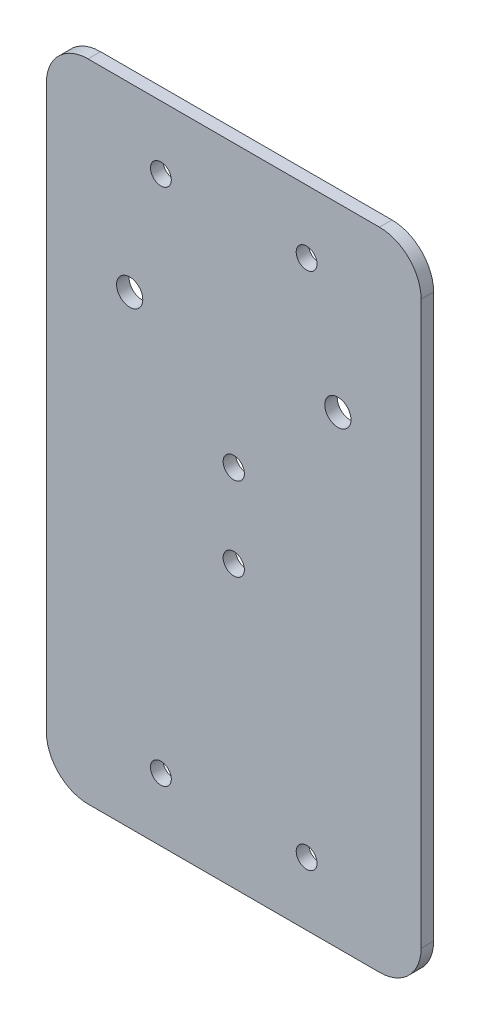
ISO-10303-21;
HEADER;
FILE_DESCRIPTION(('STEP AP214'),'2;1');
FILE_NAME('part.step','',(''),(''),'','','');
FILE_SCHEMA(('AUTOMOTIVE_DESIGN { 1 0 10303 214 1 1 1 1 }'));
ENDSEC;
DATA;
#1=APPLICATION_CONTEXT('core data for automotive mechanical design processes');
#2=APPLICATION_PROTOCOL_DEFINITION('international standard','automotive_design',2000,#1);
#3=PRODUCT_CONTEXT('',#1,'mechanical');
#4=PRODUCT('Part','Part','',(#3));
#5=PRODUCT_RELATED_PRODUCT_CATEGORY('part','',(#4));
#6=PRODUCT_DEFINITION_FORMATION('','',#4);
#7=PRODUCT_DEFINITION_CONTEXT('part definition',#1,'design');
#8=PRODUCT_DEFINITION('design','',#6,#7);
#9=PRODUCT_DEFINITION_SHAPE('','',#8);
#10=(LENGTH_UNIT() NAMED_UNIT(*) SI_UNIT(.MILLI.,.METRE.));
#11=(NAMED_UNIT(*) PLANE_ANGLE_UNIT() SI_UNIT($,.RADIAN.));
#12=(NAMED_UNIT(*) SI_UNIT($,.STERADIAN.) SOLID_ANGLE_UNIT());
#13=UNCERTAINTY_MEASURE_WITH_UNIT(LENGTH_MEASURE(1.E-05),#10,'distance_accuracy_value','');
#14=(GEOMETRIC_REPRESENTATION_CONTEXT(3) GLOBAL_UNCERTAINTY_ASSIGNED_CONTEXT((#13)) GLOBAL_UNIT_ASSIGNED_CONTEXT((#10,
#11,#12)) REPRESENTATION_CONTEXT('',''));
#15=CARTESIAN_POINT('',(0.,0.,0.));
#16=DIRECTION('',(0.,0.,1.));
#17=DIRECTION('',(1.,0.,0.));
#18=AXIS2_PLACEMENT_3D('',#15,#16,#17);
#19=CARTESIAN_POINT('',(35.,-67.5,3.));
#20=DIRECTION('',(0.,0.,-1.));
#21=DIRECTION('',(-1.,0.,0.));
#22=AXIS2_PLACEMENT_3D('',#19,#20,#21);
#23=PLANE('',#22);
#24=CARTESIAN_POINT('',(35.,-67.5,3.));
#25=DIRECTION('',(0.,0.,1.));
#26=DIRECTION('',(-1.,0.,0.));
#27=AXIS2_PLACEMENT_3D('',#24,#25,#26);
#28=CIRCLE('',#27,9.99999999999999);
#29=CARTESIAN_POINT('',(35.,-77.5,3.));
#30=VERTEX_POINT('',#29);
#31=CARTESIAN_POINT('',(45.,-67.5,3.));
#32=VERTEX_POINT('',#31);
#33=EDGE_CURVE('E151',#30,#32,#28,.T.);
#34=ORIENTED_EDGE('',*,*,#33,.T.);
#35=DIRECTION('',(0.,1.,0.));
#36=VECTOR('',#35,1.);
#37=CARTESIAN_POINT('',(45.,67.5,3.));
#38=LINE('',#37,#36);
#39=CARTESIAN_POINT('',(45.,67.5,3.));
#40=VERTEX_POINT('',#39);
#41=EDGE_CURVE('E99',#32,#40,#38,.T.);
#42=ORIENTED_EDGE('',*,*,#41,.T.);
#43=CARTESIAN_POINT('',(35.,67.5,3.));
#44=DIRECTION('',(0.,0.,1.));
#45=DIRECTION('',(-1.,0.,0.));
#46=AXIS2_PLACEMENT_3D('',#43,#44,#45);
#47=CIRCLE('',#46,10.);
#48=CARTESIAN_POINT('',(35.,77.5,3.));
#49=VERTEX_POINT('',#48);
#50=EDGE_CURVE('E166',#40,#49,#47,.T.);
#51=ORIENTED_EDGE('',*,*,#50,.T.);
#52=DIRECTION('',(-1.,0.,0.));
#53=VECTOR('',#52,1.);
#54=CARTESIAN_POINT('',(35.,77.5,3.));
#55=LINE('',#54,#53);
#56=CARTESIAN_POINT('',(-35.,77.5,3.));
#57=VERTEX_POINT('',#56);
#58=EDGE_CURVE('E179',#49,#57,#55,.T.);
#59=ORIENTED_EDGE('',*,*,#58,.T.);
#60=CARTESIAN_POINT('',(-35.,67.5,3.));
#61=DIRECTION('',(0.,0.,1.));
#62=DIRECTION('',(1.,0.,0.));
#63=AXIS2_PLACEMENT_3D('',#60,#61,#62);
#64=CIRCLE('',#63,10.);
#65=CARTESIAN_POINT('',(-45.,67.5,3.));
#66=VERTEX_POINT('',#65);
#67=EDGE_CURVE('E118',#57,#66,#64,.T.);
#68=ORIENTED_EDGE('',*,*,#67,.T.);
#69=DIRECTION('',(0.,-1.,0.));
#70=VECTOR('',#69,1.);
#71=CARTESIAN_POINT('',(-45.,67.5,3.));
#72=LINE('',#71,#70);
#73=CARTESIAN_POINT('',(-45.,-67.5,3.));
#74=VERTEX_POINT('',#73);
#75=EDGE_CURVE('E112',#66,#74,#72,.T.);
#76=ORIENTED_EDGE('',*,*,#75,.T.);
#77=CARTESIAN_POINT('',(-35.,-67.5,3.));
#78=DIRECTION('',(0.,0.,1.));
#79=DIRECTION('',(-1.,0.,0.));
#80=AXIS2_PLACEMENT_3D('',#77,#78,#79);
#81=CIRCLE('',#80,10.);
#82=CARTESIAN_POINT('',(-35.,-77.5,3.));
#83=VERTEX_POINT('',#82);
#84=EDGE_CURVE('E116',#74,#83,#81,.T.);
#85=ORIENTED_EDGE('',*,*,#84,.T.);
#86=DIRECTION('',(1.,0.,0.));
#87=VECTOR('',#86,1.);
#88=CARTESIAN_POINT('',(35.,-77.5,3.));
#89=LINE('',#88,#87);
#90=EDGE_CURVE('E56',#83,#30,#89,.T.);
#91=ORIENTED_EDGE('',*,*,#90,.T.);
#92=EDGE_LOOP('',(#34,#42,#51,#59,#68,#76,#85,#91));
#93=FACE_BOUND('',#92,.T.);
#94=CARTESIAN_POINT('',(17.5,62.325,3.));
#95=DIRECTION('',(0.,0.,1.));
#96=DIRECTION('',(1.,0.,0.));
#97=AXIS2_PLACEMENT_3D('',#94,#95,#96);
#98=CIRCLE('',#97,2.5);
#99=CARTESIAN_POINT('',(20.,62.325,3.));
#100=VERTEX_POINT('',#99);
#101=EDGE_CURVE('E140',#100,#100,#98,.T.);
#102=ORIENTED_EDGE('',*,*,#101,.F.);
#103=EDGE_LOOP('',(#102));
#104=FACE_BOUND('',#103,.T.);
#105=CARTESIAN_POINT('',(17.5,-62.325,3.));
#106=DIRECTION('',(0.,0.,1.));
#107=DIRECTION('',(-1.,0.,0.));
#108=AXIS2_PLACEMENT_3D('',#105,#106,#107);
#109=CIRCLE('',#108,2.5);
#110=CARTESIAN_POINT('',(15.,-62.325,3.));
#111=VERTEX_POINT('',#110);
#112=EDGE_CURVE('E188',#111,#111,#109,.T.);
#113=ORIENTED_EDGE('',*,*,#112,.F.);
#114=EDGE_LOOP('',(#113));
#115=FACE_BOUND('',#114,.T.);
#116=CARTESIAN_POINT('',(-17.4999999999996,-62.3250000000002,3.));
#117=DIRECTION('',(0.,0.,1.));
#118=DIRECTION('',(1.,0.,0.));
#119=AXIS2_PLACEMENT_3D('',#116,#117,#118);
#120=CIRCLE('',#119,2.5);
#121=CARTESIAN_POINT('',(-14.9999999999996,-62.3250000000002,3.));
#122=VERTEX_POINT('',#121);
#123=EDGE_CURVE('E194',#122,#122,#120,.T.);
#124=ORIENTED_EDGE('',*,*,#123,.F.);
#125=EDGE_LOOP('',(#124));
#126=FACE_BOUND('',#125,.T.);
#127=CARTESIAN_POINT('',(-17.5000000000004,62.325,3.));
#128=DIRECTION('',(0.,0.,1.));
#129=DIRECTION('',(-1.,0.,0.));
#130=AXIS2_PLACEMENT_3D('',#127,#128,#129);
#131=CIRCLE('',#130,2.50000000000001);
#132=CARTESIAN_POINT('',(-20.0000000000004,62.325,3.));
#133=VERTEX_POINT('',#132);
#134=EDGE_CURVE('E200',#133,#133,#131,.T.);
#135=ORIENTED_EDGE('',*,*,#134,.F.);
#136=EDGE_LOOP('',(#135));
#137=FACE_BOUND('',#136,.T.);
#138=CARTESIAN_POINT('',(0.,10.,3.));
#139=DIRECTION('',(0.,0.,1.));
#140=DIRECTION('',(1.,0.,0.));
#141=AXIS2_PLACEMENT_3D('',#138,#139,#140);
#142=CIRCLE('',#141,2.55);
#143=CARTESIAN_POINT('',(2.55,10.,3.));
#144=VERTEX_POINT('',#143);
#145=EDGE_CURVE('E206',#144,#144,#142,.T.);
#146=ORIENTED_EDGE('',*,*,#145,.F.);
#147=EDGE_LOOP('',(#146));
#148=FACE_BOUND('',#147,.T.);
#149=CARTESIAN_POINT('',(0.,-10.,3.));
#150=DIRECTION('',(0.,0.,1.));
#151=DIRECTION('',(-1.,0.,0.));
#152=AXIS2_PLACEMENT_3D('',#149,#150,#151);
#153=CIRCLE('',#152,2.55);
#154=CARTESIAN_POINT('',(-2.55,-10.,3.));
#155=VERTEX_POINT('',#154);
#156=EDGE_CURVE('E212',#155,#155,#153,.T.);
#157=ORIENTED_EDGE('',*,*,#156,.F.);
#158=EDGE_LOOP('',(#157));
#159=FACE_BOUND('',#158,.T.);
#160=CARTESIAN_POINT('',(-25.,34.,3.));
#161=DIRECTION('',(0.,0.,1.));
#162=DIRECTION('',(1.,0.,0.));
#163=AXIS2_PLACEMENT_3D('',#160,#161,#162);
#164=CIRCLE('',#163,3.15);
#165=CARTESIAN_POINT('',(-21.85,34.,3.));
#166=VERTEX_POINT('',#165);
#167=EDGE_CURVE('E218',#166,#166,#164,.T.);
#168=ORIENTED_EDGE('',*,*,#167,.F.);
#169=EDGE_LOOP('',(#168));
#170=FACE_BOUND('',#169,.T.);
#171=CARTESIAN_POINT('',(25.,34.,3.));
#172=DIRECTION('',(0.,0.,1.));
#173=DIRECTION('',(-1.,0.,0.));
#174=AXIS2_PLACEMENT_3D('',#171,#172,#173);
#175=CIRCLE('',#174,3.15);
#176=CARTESIAN_POINT('',(21.85,34.,3.));
#177=VERTEX_POINT('',#176);
#178=EDGE_CURVE('E224',#177,#177,#175,.T.);
#179=ORIENTED_EDGE('',*,*,#178,.F.);
#180=EDGE_LOOP('',(#179));
#181=FACE_BOUND('',#180,.T.);
#182=ADVANCED_FACE('F39',(#93,#104,#115,#126,#137,#148,#159,#170,#181),#23,.F.);
#183=CARTESIAN_POINT('',(35.,-67.5,0.));
#184=DIRECTION('',(0.,0.,-1.));
#185=DIRECTION('',(-1.,0.,0.));
#186=AXIS2_PLACEMENT_3D('',#183,#184,#185);
#187=PLANE('',#186);
#188=CARTESIAN_POINT('',(-25.,34.,0.));
#189=DIRECTION('',(0.,0.,1.));
#190=DIRECTION('',(1.,0.,0.));
#191=AXIS2_PLACEMENT_3D('',#188,#189,#190);
#192=CIRCLE('',#191,3.15);
#193=CARTESIAN_POINT('',(-21.85,34.,0.));
#194=VERTEX_POINT('',#193);
#195=EDGE_CURVE('E221',#194,#194,#192,.T.);
#196=ORIENTED_EDGE('',*,*,#195,.T.);
#197=EDGE_LOOP('',(#196));
#198=FACE_BOUND('',#197,.T.);
#199=CARTESIAN_POINT('',(0.,10.,0.));
#200=DIRECTION('',(0.,0.,1.));
#201=DIRECTION('',(1.,0.,0.));
#202=AXIS2_PLACEMENT_3D('',#199,#200,#201);
#203=CIRCLE('',#202,2.55);
#204=CARTESIAN_POINT('',(2.55,10.,0.));
#205=VERTEX_POINT('',#204);
#206=EDGE_CURVE('E209',#205,#205,#203,.T.);
#207=ORIENTED_EDGE('',*,*,#206,.T.);
#208=EDGE_LOOP('',(#207));
#209=FACE_BOUND('',#208,.T.);
#210=CARTESIAN_POINT('',(-17.4999999999996,-62.3250000000002,0.));
#211=DIRECTION('',(0.,0.,1.));
#212=DIRECTION('',(1.,0.,0.));
#213=AXIS2_PLACEMENT_3D('',#210,#211,#212);
#214=CIRCLE('',#213,2.5);
#215=CARTESIAN_POINT('',(-14.9999999999996,-62.3250000000002,0.));
#216=VERTEX_POINT('',#215);
#217=EDGE_CURVE('E197',#216,#216,#214,.T.);
#218=ORIENTED_EDGE('',*,*,#217,.T.);
#219=EDGE_LOOP('',(#218));
#220=FACE_BOUND('',#219,.T.);
#221=CARTESIAN_POINT('',(17.5,62.325,0.));
#222=DIRECTION('',(0.,0.,1.));
#223=DIRECTION('',(1.,0.,0.));
#224=AXIS2_PLACEMENT_3D('',#221,#222,#223);
#225=CIRCLE('',#224,2.5);
#226=CARTESIAN_POINT('',(20.,62.325,0.));
#227=VERTEX_POINT('',#226);
#228=EDGE_CURVE('E185',#227,#227,#225,.T.);
#229=ORIENTED_EDGE('',*,*,#228,.T.);
#230=EDGE_LOOP('',(#229));
#231=FACE_BOUND('',#230,.T.);
#232=CARTESIAN_POINT('',(35.,-67.5,0.));
#233=DIRECTION('',(0.,0.,1.));
#234=DIRECTION('',(-1.,0.,0.));
#235=AXIS2_PLACEMENT_3D('',#232,#233,#234);
#236=CIRCLE('',#235,9.99999999999999);
#237=CARTESIAN_POINT('',(35.,-77.5,0.));
#238=VERTEX_POINT('',#237);
#239=CARTESIAN_POINT('',(45.,-67.5,0.));
#240=VERTEX_POINT('',#239);
#241=EDGE_CURVE('E136',#238,#240,#236,.T.);
#242=ORIENTED_EDGE('',*,*,#241,.F.);
#243=DIRECTION('',(1.,0.,0.));
#244=VECTOR('',#243,1.);
#245=CARTESIAN_POINT('',(35.,-77.5,0.));
#246=LINE('',#245,#244);
#247=CARTESIAN_POINT('',(-35.,-77.5,0.));
#248=VERTEX_POINT('',#247);
#249=EDGE_CURVE('E91',#248,#238,#246,.T.);
#250=ORIENTED_EDGE('',*,*,#249,.F.);
#251=CARTESIAN_POINT('',(-35.,-67.5,0.));
#252=DIRECTION('',(0.,0.,1.));
#253=DIRECTION('',(-1.,0.,0.));
#254=AXIS2_PLACEMENT_3D('',#251,#252,#253);
#255=CIRCLE('',#254,10.);
#256=CARTESIAN_POINT('',(-45.,-67.5,0.));
#257=VERTEX_POINT('',#256);
#258=EDGE_CURVE('E85',#257,#248,#255,.T.);
#259=ORIENTED_EDGE('',*,*,#258,.F.);
#260=DIRECTION('',(0.,-1.,0.));
#261=VECTOR('',#260,1.);
#262=CARTESIAN_POINT('',(-45.,67.5,0.));
#263=LINE('',#262,#261);
#264=CARTESIAN_POINT('',(-45.,67.5,0.));
#265=VERTEX_POINT('',#264);
#266=EDGE_CURVE('E126',#265,#257,#263,.T.);
#267=ORIENTED_EDGE('',*,*,#266,.F.);
#268=CARTESIAN_POINT('',(-35.,67.5,0.));
#269=DIRECTION('',(0.,0.,1.));
#270=DIRECTION('',(1.,0.,0.));
#271=AXIS2_PLACEMENT_3D('',#268,#269,#270);
#272=CIRCLE('',#271,10.);
#273=CARTESIAN_POINT('',(-35.,77.5,0.));
#274=VERTEX_POINT('',#273);
#275=EDGE_CURVE('E146',#274,#265,#272,.T.);
#276=ORIENTED_EDGE('',*,*,#275,.F.);
#277=DIRECTION('',(-1.,0.,0.));
#278=VECTOR('',#277,1.);
#279=CARTESIAN_POINT('',(35.,77.5,0.));
#280=LINE('',#279,#278);
#281=CARTESIAN_POINT('',(35.,77.5,0.));
#282=VERTEX_POINT('',#281);
#283=EDGE_CURVE('E144',#282,#274,#280,.T.);
#284=ORIENTED_EDGE('',*,*,#283,.F.);
#285=CARTESIAN_POINT('',(35.,67.5,0.));
#286=DIRECTION('',(0.,0.,1.));
#287=DIRECTION('',(-1.,0.,0.));
#288=AXIS2_PLACEMENT_3D('',#285,#286,#287);
#289=CIRCLE('',#288,10.);
#290=CARTESIAN_POINT('',(45.,67.5,0.));
#291=VERTEX_POINT('',#290);
#292=EDGE_CURVE('E142',#291,#282,#289,.T.);
#293=ORIENTED_EDGE('',*,*,#292,.F.);
#294=DIRECTION('',(0.,1.,0.));
#295=VECTOR('',#294,1.);
#296=CARTESIAN_POINT('',(45.,67.5,0.));
#297=LINE('',#296,#295);
#298=EDGE_CURVE('E139',#240,#291,#297,.T.);
#299=ORIENTED_EDGE('',*,*,#298,.F.);
#300=EDGE_LOOP('',(#242,#250,#259,#267,#276,#284,#293,#299));
#301=FACE_BOUND('',#300,.T.);
#302=CARTESIAN_POINT('',(17.5,-62.325,0.));
#303=DIRECTION('',(0.,0.,1.));
#304=DIRECTION('',(-1.,0.,0.));
#305=AXIS2_PLACEMENT_3D('',#302,#303,#304);
#306=CIRCLE('',#305,2.5);
#307=CARTESIAN_POINT('',(15.,-62.325,0.));
#308=VERTEX_POINT('',#307);
#309=EDGE_CURVE('E191',#308,#308,#306,.T.);
#310=ORIENTED_EDGE('',*,*,#309,.T.);
#311=EDGE_LOOP('',(#310));
#312=FACE_BOUND('',#311,.T.);
#313=CARTESIAN_POINT('',(-17.5000000000004,62.325,0.));
#314=DIRECTION('',(0.,0.,1.));
#315=DIRECTION('',(-1.,0.,0.));
#316=AXIS2_PLACEMENT_3D('',#313,#314,#315);
#317=CIRCLE('',#316,2.50000000000001);
#318=CARTESIAN_POINT('',(-20.0000000000004,62.325,0.));
#319=VERTEX_POINT('',#318);
#320=EDGE_CURVE('E203',#319,#319,#317,.T.);
#321=ORIENTED_EDGE('',*,*,#320,.T.);
#322=EDGE_LOOP('',(#321));
#323=FACE_BOUND('',#322,.T.);
#324=CARTESIAN_POINT('',(0.,-10.,0.));
#325=DIRECTION('',(0.,0.,1.));
#326=DIRECTION('',(-1.,0.,0.));
#327=AXIS2_PLACEMENT_3D('',#324,#325,#326);
#328=CIRCLE('',#327,2.55);
#329=CARTESIAN_POINT('',(-2.55,-10.,0.));
#330=VERTEX_POINT('',#329);
#331=EDGE_CURVE('E215',#330,#330,#328,.T.);
#332=ORIENTED_EDGE('',*,*,#331,.T.);
#333=EDGE_LOOP('',(#332));
#334=FACE_BOUND('',#333,.T.);
#335=CARTESIAN_POINT('',(25.,34.,0.));
#336=DIRECTION('',(0.,0.,1.));
#337=DIRECTION('',(-1.,0.,0.));
#338=AXIS2_PLACEMENT_3D('',#335,#336,#337);
#339=CIRCLE('',#338,3.15);
#340=CARTESIAN_POINT('',(21.85,34.,0.));
#341=VERTEX_POINT('',#340);
#342=EDGE_CURVE('E227',#341,#341,#339,.T.);
#343=ORIENTED_EDGE('',*,*,#342,.T.);
#344=EDGE_LOOP('',(#343));
#345=FACE_BOUND('',#344,.T.);
#346=ADVANCED_FACE('F170',(#198,#209,#220,#231,#301,#312,#323,#334,#345),#187,.T.);
#347=CARTESIAN_POINT('',(35.,-67.5,3.));
#348=DIRECTION('',(0.,0.,-1.));
#349=DIRECTION('',(-1.,0.,0.));
#350=AXIS2_PLACEMENT_3D('',#347,#348,#349);
#351=CYLINDRICAL_SURFACE('',#350,9.99999999999999);
#352=ORIENTED_EDGE('',*,*,#241,.T.);
#353=DIRECTION('',(0.,0.,-1.));
#354=VECTOR('',#353,1.);
#355=CARTESIAN_POINT('',(45.,-67.5,3.));
#356=LINE('',#355,#354);
#357=EDGE_CURVE('E11',#32,#240,#356,.T.);
#358=ORIENTED_EDGE('',*,*,#357,.F.);
#359=ORIENTED_EDGE('',*,*,#33,.F.);
#360=DIRECTION('',(0.,0.,-1.));
#361=VECTOR('',#360,1.);
#362=CARTESIAN_POINT('',(35.,-77.5,3.));
#363=LINE('',#362,#361);
#364=EDGE_CURVE('E132',#30,#238,#363,.T.);
#365=ORIENTED_EDGE('',*,*,#364,.T.);
#366=EDGE_LOOP('',(#352,#358,#359,#365));
#367=FACE_BOUND('',#366,.T.);
#368=ADVANCED_FACE('F41',(#367),#351,.T.);
#369=CARTESIAN_POINT('',(45.,67.5,3.));
#370=DIRECTION('',(-1.,0.,0.));
#371=DIRECTION('',(0.,-1.,0.));
#372=AXIS2_PLACEMENT_3D('',#369,#370,#371);
#373=PLANE('',#372);
#374=ORIENTED_EDGE('',*,*,#298,.T.);
#375=DIRECTION('',(0.,0.,-1.));
#376=VECTOR('',#375,1.);
#377=CARTESIAN_POINT('',(45.,67.5,3.));
#378=LINE('',#377,#376);
#379=EDGE_CURVE('E48',#40,#291,#378,.T.);
#380=ORIENTED_EDGE('',*,*,#379,.F.);
#381=ORIENTED_EDGE('',*,*,#41,.F.);
#382=ORIENTED_EDGE('',*,*,#357,.T.);
#383=EDGE_LOOP('',(#374,#380,#381,#382));
#384=FACE_BOUND('',#383,.T.);
#385=ADVANCED_FACE('F259',(#384),#373,.F.);
#386=CARTESIAN_POINT('',(35.,67.5,3.));
#387=DIRECTION('',(0.,0.,-1.));
#388=DIRECTION('',(-1.,0.,0.));
#389=AXIS2_PLACEMENT_3D('',#386,#387,#388);
#390=CYLINDRICAL_SURFACE('',#389,10.);
#391=ORIENTED_EDGE('',*,*,#292,.T.);
#392=DIRECTION('',(0.,0.,-1.));
#393=VECTOR('',#392,1.);
#394=CARTESIAN_POINT('',(35.,77.5,3.));
#395=LINE('',#394,#393);
#396=EDGE_CURVE('E158',#49,#282,#395,.T.);
#397=ORIENTED_EDGE('',*,*,#396,.F.);
#398=ORIENTED_EDGE('',*,*,#50,.F.);
#399=ORIENTED_EDGE('',*,*,#379,.T.);
#400=EDGE_LOOP('',(#391,#397,#398,#399));
#401=FACE_BOUND('',#400,.T.);
#402=ADVANCED_FACE('F164',(#401),#390,.T.);
#403=CARTESIAN_POINT('',(35.,77.5,3.));
#404=DIRECTION('',(0.,-1.,0.));
#405=DIRECTION('',(0.,0.,-1.));
#406=AXIS2_PLACEMENT_3D('',#403,#404,#405);
#407=PLANE('',#406);
#408=ORIENTED_EDGE('',*,*,#283,.T.);
#409=DIRECTION('',(0.,0.,-1.));
#410=VECTOR('',#409,1.);
#411=CARTESIAN_POINT('',(-35.,77.5,3.));
#412=LINE('',#411,#410);
#413=EDGE_CURVE('E155',#57,#274,#412,.T.);
#414=ORIENTED_EDGE('',*,*,#413,.F.);
#415=ORIENTED_EDGE('',*,*,#58,.F.);
#416=ORIENTED_EDGE('',*,*,#396,.T.);
#417=EDGE_LOOP('',(#408,#414,#415,#416));
#418=FACE_BOUND('',#417,.T.);
#419=ADVANCED_FACE('F175',(#418),#407,.F.);
#420=CARTESIAN_POINT('',(-35.,67.5,3.));
#421=DIRECTION('',(0.,0.,-1.));
#422=DIRECTION('',(-1.,0.,0.));
#423=AXIS2_PLACEMENT_3D('',#420,#421,#422);
#424=CYLINDRICAL_SURFACE('',#423,10.);
#425=ORIENTED_EDGE('',*,*,#275,.T.);
#426=DIRECTION('',(0.,0.,-1.));
#427=VECTOR('',#426,1.);
#428=CARTESIAN_POINT('',(-45.,67.5,3.));
#429=LINE('',#428,#427);
#430=EDGE_CURVE('E127',#66,#265,#429,.T.);
#431=ORIENTED_EDGE('',*,*,#430,.F.);
#432=ORIENTED_EDGE('',*,*,#67,.F.);
#433=ORIENTED_EDGE('',*,*,#413,.T.);
#434=EDGE_LOOP('',(#425,#431,#432,#433));
#435=FACE_BOUND('',#434,.T.);
#436=ADVANCED_FACE('F178',(#435),#424,.T.);
#437=CARTESIAN_POINT('',(-45.,67.5,3.));
#438=DIRECTION('',(1.,0.,0.));
#439=DIRECTION('',(0.,1.,0.));
#440=AXIS2_PLACEMENT_3D('',#437,#438,#439);
#441=PLANE('',#440);
#442=ORIENTED_EDGE('',*,*,#266,.T.);
#443=DIRECTION('',(0.,0.,-1.));
#444=VECTOR('',#443,1.);
#445=CARTESIAN_POINT('',(-45.,-67.5,3.));
#446=LINE('',#445,#444);
#447=EDGE_CURVE('E123',#74,#257,#446,.T.);
#448=ORIENTED_EDGE('',*,*,#447,.F.);
#449=ORIENTED_EDGE('',*,*,#75,.F.);
#450=ORIENTED_EDGE('',*,*,#430,.T.);
#451=EDGE_LOOP('',(#442,#448,#449,#450));
#452=FACE_BOUND('',#451,.T.);
#453=ADVANCED_FACE('F124',(#452),#441,.F.);
#454=CARTESIAN_POINT('',(-35.,-67.5,3.));
#455=DIRECTION('',(0.,0.,-1.));
#456=DIRECTION('',(-1.,0.,0.));
#457=AXIS2_PLACEMENT_3D('',#454,#455,#456);
#458=CYLINDRICAL_SURFACE('',#457,10.);
#459=ORIENTED_EDGE('',*,*,#258,.T.);
#460=DIRECTION('',(0.,0.,-1.));
#461=VECTOR('',#460,1.);
#462=CARTESIAN_POINT('',(-35.,-77.5,3.));
#463=LINE('',#462,#461);
#464=EDGE_CURVE('E128',#83,#248,#463,.T.);
#465=ORIENTED_EDGE('',*,*,#464,.F.);
#466=ORIENTED_EDGE('',*,*,#84,.F.);
#467=ORIENTED_EDGE('',*,*,#447,.T.);
#468=EDGE_LOOP('',(#459,#465,#466,#467));
#469=FACE_BOUND('',#468,.T.);
#470=ADVANCED_FACE('F130',(#469),#458,.T.);
#471=CARTESIAN_POINT('',(35.,-77.5,3.));
#472=DIRECTION('',(0.,1.,0.));
#473=DIRECTION('',(-1.,0.,0.));
#474=AXIS2_PLACEMENT_3D('',#471,#472,#473);
#475=PLANE('',#474);
#476=ORIENTED_EDGE('',*,*,#249,.T.);
#477=ORIENTED_EDGE('',*,*,#364,.F.);
#478=ORIENTED_EDGE('',*,*,#90,.F.);
#479=ORIENTED_EDGE('',*,*,#464,.T.);
#480=EDGE_LOOP('',(#476,#477,#478,#479));
#481=FACE_BOUND('',#480,.T.);
#482=ADVANCED_FACE('F247',(#481),#475,.F.);
#483=CARTESIAN_POINT('',(17.5,62.325,3.));
#484=DIRECTION('',(0.,0.,-1.));
#485=DIRECTION('',(-1.,0.,0.));
#486=AXIS2_PLACEMENT_3D('',#483,#484,#485);
#487=CYLINDRICAL_SURFACE('',#486,2.5);
#488=ORIENTED_EDGE('',*,*,#101,.T.);
#489=EDGE_LOOP('',(#488));
#490=FACE_BOUND('',#489,.T.);
#491=ORIENTED_EDGE('',*,*,#228,.F.);
#492=EDGE_LOOP('',(#491));
#493=FACE_BOUND('',#492,.T.);
#494=ADVANCED_FACE('F244',(#490,#493),#487,.F.);
#495=CARTESIAN_POINT('',(17.5,-62.325,3.));
#496=DIRECTION('',(0.,0.,-1.));
#497=DIRECTION('',(-1.,0.,0.));
#498=AXIS2_PLACEMENT_3D('',#495,#496,#497);
#499=CYLINDRICAL_SURFACE('',#498,2.5);
#500=ORIENTED_EDGE('',*,*,#112,.T.);
#501=EDGE_LOOP('',(#500));
#502=FACE_BOUND('',#501,.T.);
#503=ORIENTED_EDGE('',*,*,#309,.F.);
#504=EDGE_LOOP('',(#503));
#505=FACE_BOUND('',#504,.T.);
#506=ADVANCED_FACE('F323',(#502,#505),#499,.F.);
#507=CARTESIAN_POINT('',(-17.4999999999996,-62.3250000000002,3.));
#508=DIRECTION('',(0.,0.,-1.));
#509=DIRECTION('',(-1.,0.,0.));
#510=AXIS2_PLACEMENT_3D('',#507,#508,#509);
#511=CYLINDRICAL_SURFACE('',#510,2.5);
#512=ORIENTED_EDGE('',*,*,#123,.T.);
#513=EDGE_LOOP('',(#512));
#514=FACE_BOUND('',#513,.T.);
#515=ORIENTED_EDGE('',*,*,#217,.F.);
#516=EDGE_LOOP('',(#515));
#517=FACE_BOUND('',#516,.T.);
#518=ADVANCED_FACE('F331',(#514,#517),#511,.F.);
#519=CARTESIAN_POINT('',(-17.5000000000004,62.325,3.));
#520=DIRECTION('',(0.,0.,-1.));
#521=DIRECTION('',(-1.,0.,0.));
#522=AXIS2_PLACEMENT_3D('',#519,#520,#521);
#523=CYLINDRICAL_SURFACE('',#522,2.50000000000001);
#524=ORIENTED_EDGE('',*,*,#134,.T.);
#525=EDGE_LOOP('',(#524));
#526=FACE_BOUND('',#525,.T.);
#527=ORIENTED_EDGE('',*,*,#320,.F.);
#528=EDGE_LOOP('',(#527));
#529=FACE_BOUND('',#528,.T.);
#530=ADVANCED_FACE('F339',(#526,#529),#523,.F.);
#531=CARTESIAN_POINT('',(0.,10.,3.));
#532=DIRECTION('',(0.,0.,-1.));
#533=DIRECTION('',(-1.,0.,0.));
#534=AXIS2_PLACEMENT_3D('',#531,#532,#533);
#535=CYLINDRICAL_SURFACE('',#534,2.55);
#536=ORIENTED_EDGE('',*,*,#145,.T.);
#537=EDGE_LOOP('',(#536));
#538=FACE_BOUND('',#537,.T.);
#539=ORIENTED_EDGE('',*,*,#206,.F.);
#540=EDGE_LOOP('',(#539));
#541=FACE_BOUND('',#540,.T.);
#542=ADVANCED_FACE('F348',(#538,#541),#535,.F.);
#543=CARTESIAN_POINT('',(0.,-10.,3.));
#544=DIRECTION('',(0.,0.,-1.));
#545=DIRECTION('',(-1.,0.,0.));
#546=AXIS2_PLACEMENT_3D('',#543,#544,#545);
#547=CYLINDRICAL_SURFACE('',#546,2.55);
#548=ORIENTED_EDGE('',*,*,#156,.T.);
#549=EDGE_LOOP('',(#548));
#550=FACE_BOUND('',#549,.T.);
#551=ORIENTED_EDGE('',*,*,#331,.F.);
#552=EDGE_LOOP('',(#551));
#553=FACE_BOUND('',#552,.T.);
#554=ADVANCED_FACE('F357',(#550,#553),#547,.F.);
#555=CARTESIAN_POINT('',(-25.,34.,3.));
#556=DIRECTION('',(0.,0.,-1.));
#557=DIRECTION('',(-1.,0.,0.));
#558=AXIS2_PLACEMENT_3D('',#555,#556,#557);
#559=CYLINDRICAL_SURFACE('',#558,3.15);
#560=ORIENTED_EDGE('',*,*,#167,.T.);
#561=EDGE_LOOP('',(#560));
#562=FACE_BOUND('',#561,.T.);
#563=ORIENTED_EDGE('',*,*,#195,.F.);
#564=EDGE_LOOP('',(#563));
#565=FACE_BOUND('',#564,.T.);
#566=ADVANCED_FACE('F366',(#562,#565),#559,.F.);
#567=CARTESIAN_POINT('',(25.,34.,3.));
#568=DIRECTION('',(0.,0.,-1.));
#569=DIRECTION('',(-1.,0.,0.));
#570=AXIS2_PLACEMENT_3D('',#567,#568,#569);
#571=CYLINDRICAL_SURFACE('',#570,3.15);
#572=ORIENTED_EDGE('',*,*,#178,.T.);
#573=EDGE_LOOP('',(#572));
#574=FACE_BOUND('',#573,.T.);
#575=ORIENTED_EDGE('',*,*,#342,.F.);
#576=EDGE_LOOP('',(#575));
#577=FACE_BOUND('',#576,.T.);
#578=ADVANCED_FACE('F233',(#574,#577),#571,.F.);
#579=CLOSED_SHELL('',(#182,#346,#368,#385,#402,#419,#436,#453,#470,#482,#494,#506,#518,#530,
#542,#554,#566,#578));
#580=MANIFOLD_SOLID_BREP('B2',#579);
#581=ADVANCED_BREP_SHAPE_REPRESENTATION('',(#18,#580),#14);
#582=SHAPE_DEFINITION_REPRESENTATION(#9,#581);
ENDSEC;
END-ISO-10303-21;
